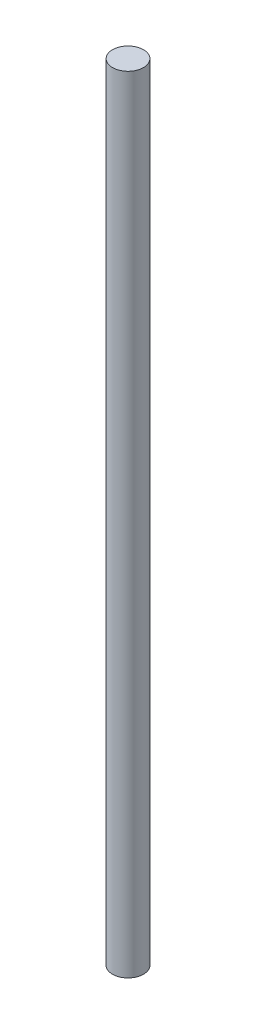
ISO-10303-21;
HEADER;
FILE_DESCRIPTION(('STEP AP214'),'2;1');
FILE_NAME('part.step','',(''),(''),'','','');
FILE_SCHEMA(('AUTOMOTIVE_DESIGN { 1 0 10303 214 1 1 1 1 }'));
ENDSEC;
DATA;
#1=APPLICATION_CONTEXT('core data for automotive mechanical design processes');
#2=APPLICATION_PROTOCOL_DEFINITION('international standard','automotive_design',2000,#1);
#3=PRODUCT_CONTEXT('',#1,'mechanical');
#4=PRODUCT('Part','Part','',(#3));
#5=PRODUCT_RELATED_PRODUCT_CATEGORY('part','',(#4));
#6=PRODUCT_DEFINITION_FORMATION('','',#4);
#7=PRODUCT_DEFINITION_CONTEXT('part definition',#1,'design');
#8=PRODUCT_DEFINITION('design','',#6,#7);
#9=PRODUCT_DEFINITION_SHAPE('','',#8);
#10=(LENGTH_UNIT() NAMED_UNIT(*) SI_UNIT(.MILLI.,.METRE.));
#11=(NAMED_UNIT(*) PLANE_ANGLE_UNIT() SI_UNIT($,.RADIAN.));
#12=(NAMED_UNIT(*) SI_UNIT($,.STERADIAN.) SOLID_ANGLE_UNIT());
#13=UNCERTAINTY_MEASURE_WITH_UNIT(LENGTH_MEASURE(1.E-05),#10,'distance_accuracy_value','');
#14=(GEOMETRIC_REPRESENTATION_CONTEXT(3) GLOBAL_UNCERTAINTY_ASSIGNED_CONTEXT((#13)) GLOBAL_UNIT_ASSIGNED_CONTEXT((#10,
#11,#12)) REPRESENTATION_CONTEXT('',''));
#15=CARTESIAN_POINT('',(0.,0.,0.));
#16=DIRECTION('',(0.,0.,1.));
#17=DIRECTION('',(1.,0.,0.));
#18=AXIS2_PLACEMENT_3D('',#15,#16,#17);
#19=CARTESIAN_POINT('',(0.,241.3,0.));
#20=DIRECTION('',(0.,-1.,0.));
#21=DIRECTION('',(0.,0.,-1.));
#22=AXIS2_PLACEMENT_3D('',#19,#20,#21);
#23=CYLINDRICAL_SURFACE('',#22,4.7625);
#24=CARTESIAN_POINT('',(0.,241.3,0.));
#25=DIRECTION('',(0.,1.,0.));
#26=DIRECTION('',(0.,0.,1.));
#27=AXIS2_PLACEMENT_3D('',#24,#25,#26);
#28=CIRCLE('',#27,4.7625);
#29=CARTESIAN_POINT('',(0.,241.3,-4.7625));
#30=VERTEX_POINT('',#29);
#31=EDGE_CURVE('E10',#30,#30,#28,.T.);
#32=CARTESIAN_POINT('',(0.,0.,0.));
#33=DIRECTION('',(0.,1.,0.));
#34=DIRECTION('',(0.,0.,1.));
#35=AXIS2_PLACEMENT_3D('',#32,#33,#34);
#36=CIRCLE('',#35,4.7625);
#37=CARTESIAN_POINT('',(0.,0.,-4.7625));
#38=VERTEX_POINT('',#37);
#39=EDGE_CURVE('E39',#38,#38,#36,.T.);
#40=CARTESIAN_POINT('',(0.,241.3,-4.7625));
#41=CARTESIAN_POINT('',(0.,238.786458333333,-4.7625));
#42=CARTESIAN_POINT('',(0.,236.272916666667,-4.7625));
#43=CARTESIAN_POINT('',(0.,231.245833333333,-4.7625));
#44=CARTESIAN_POINT('',(0.,228.732291666667,-4.7625));
#45=CARTESIAN_POINT('',(0.,223.705208333333,-4.7625));
#46=CARTESIAN_POINT('',(0.,221.191666666667,-4.7625));
#47=CARTESIAN_POINT('',(0.,216.164583333333,-4.7625));
#48=CARTESIAN_POINT('',(0.,213.651041666667,-4.7625));
#49=CARTESIAN_POINT('',(0.,208.623958333333,-4.7625));
#50=CARTESIAN_POINT('',(0.,206.110416666667,-4.7625));
#51=CARTESIAN_POINT('',(0.,201.083333333333,-4.7625));
#52=CARTESIAN_POINT('',(0.,198.569791666667,-4.7625));
#53=CARTESIAN_POINT('',(0.,193.542708333333,-4.7625));
#54=CARTESIAN_POINT('',(0.,191.029166666667,-4.7625));
#55=CARTESIAN_POINT('',(0.,186.002083333333,-4.7625));
#56=CARTESIAN_POINT('',(0.,183.488541666667,-4.7625));
#57=CARTESIAN_POINT('',(0.,178.461458333333,-4.7625));
#58=CARTESIAN_POINT('',(0.,175.947916666667,-4.7625));
#59=CARTESIAN_POINT('',(0.,170.920833333333,-4.7625));
#60=CARTESIAN_POINT('',(0.,168.407291666667,-4.7625));
#61=CARTESIAN_POINT('',(0.,163.380208333333,-4.7625));
#62=CARTESIAN_POINT('',(0.,160.866666666667,-4.7625));
#63=CARTESIAN_POINT('',(0.,155.839583333333,-4.7625));
#64=CARTESIAN_POINT('',(0.,153.326041666667,-4.7625));
#65=CARTESIAN_POINT('',(0.,148.298958333333,-4.7625));
#66=CARTESIAN_POINT('',(0.,145.785416666667,-4.7625));
#67=CARTESIAN_POINT('',(0.,140.758333333333,-4.7625));
#68=CARTESIAN_POINT('',(0.,138.244791666667,-4.7625));
#69=CARTESIAN_POINT('',(0.,133.217708333333,-4.7625));
#70=CARTESIAN_POINT('',(0.,130.704166666667,-4.7625));
#71=CARTESIAN_POINT('',(0.,125.677083333333,-4.7625));
#72=CARTESIAN_POINT('',(0.,123.163541666667,-4.7625));
#73=CARTESIAN_POINT('',(0.,118.136458333333,-4.7625));
#74=CARTESIAN_POINT('',(0.,115.622916666667,-4.7625));
#75=CARTESIAN_POINT('',(0.,110.595833333333,-4.7625));
#76=CARTESIAN_POINT('',(0.,108.082291666667,-4.7625));
#77=CARTESIAN_POINT('',(0.,103.055208333333,-4.7625));
#78=CARTESIAN_POINT('',(0.,100.541666666667,-4.7625));
#79=CARTESIAN_POINT('',(0.,95.5145833333333,-4.7625));
#80=CARTESIAN_POINT('',(0.,93.0010416666667,-4.7625));
#81=CARTESIAN_POINT('',(0.,87.9739583333333,-4.7625));
#82=CARTESIAN_POINT('',(0.,85.4604166666667,-4.7625));
#83=CARTESIAN_POINT('',(0.,80.4333333333333,-4.7625));
#84=CARTESIAN_POINT('',(0.,77.9197916666667,-4.7625));
#85=CARTESIAN_POINT('',(0.,72.8927083333333,-4.7625));
#86=CARTESIAN_POINT('',(0.,70.3791666666667,-4.7625));
#87=CARTESIAN_POINT('',(0.,65.3520833333333,-4.7625));
#88=CARTESIAN_POINT('',(0.,62.8385416666667,-4.7625));
#89=CARTESIAN_POINT('',(0.,57.8114583333333,-4.7625));
#90=CARTESIAN_POINT('',(0.,55.2979166666667,-4.7625));
#91=CARTESIAN_POINT('',(0.,50.2708333333333,-4.7625));
#92=CARTESIAN_POINT('',(0.,47.7572916666667,-4.7625));
#93=CARTESIAN_POINT('',(0.,42.7302083333333,-4.7625));
#94=CARTESIAN_POINT('',(0.,40.2166666666667,-4.7625));
#95=CARTESIAN_POINT('',(0.,35.1895833333333,-4.7625));
#96=CARTESIAN_POINT('',(0.,32.6760416666667,-4.7625));
#97=CARTESIAN_POINT('',(0.,27.6489583333333,-4.7625));
#98=CARTESIAN_POINT('',(0.,25.1354166666667,-4.7625));
#99=CARTESIAN_POINT('',(0.,20.1083333333333,-4.7625));
#100=CARTESIAN_POINT('',(0.,17.5947916666667,-4.7625));
#101=CARTESIAN_POINT('',(0.,12.5677083333333,-4.7625));
#102=CARTESIAN_POINT('',(0.,10.0541666666667,-4.7625));
#103=CARTESIAN_POINT('',(0.,5.02708333333333,-4.7625));
#104=CARTESIAN_POINT('',(0.,2.51354166666667,-4.7625));
#105=CARTESIAN_POINT('',(0.,0.,-4.7625));
#106=B_SPLINE_CURVE_WITH_KNOTS('',3,(#40,#41,#42,#43,#44,#45,#46,#47,#48,#49,#50,#51,#52,#53,
#54,#55,#56,#57,#58,#59,#60,#61,#62,#63,#64,#65,#66,#67,#68,#69,#70,#71,#72,#73,#74,#75,#76,#77,
#78,#79,#80,#81,#82,#83,#84,#85,#86,#87,#88,#89,#90,#91,#92,#93,#94,#95,#96,#97,#98,#99,#100,
#101,#102,#103,#104,#105),.UNSPECIFIED.,.F.,.F.,(4,2,2,2,2,2,2,2,2,2,2,2,2,2,2,2,2,2,2,2,2,2,2,
2,2,2,2,2,2,2,2,2,4),(0.,7.540625,15.08125,22.621875,30.1625,37.703125,45.24375,52.784375,
60.325,67.865625,75.40625,82.946875,90.4875,98.028125,105.56875,113.109375,120.65,128.190625,
135.73125,143.271875,150.8125,158.353125,165.89375,173.434375,180.975,188.515625,196.05625,
203.596875,211.1375,218.678125,226.21875,233.759375,241.3),.UNSPECIFIED.);
#107=EDGE_CURVE('BSEAM36',#30,#38,#106,.T.);
#108=ORIENTED_EDGE('',*,*,#31,.F.);
#109=ORIENTED_EDGE('',*,*,#39,.T.);
#110=ORIENTED_EDGE('',*,*,#107,.T.);
#111=ORIENTED_EDGE('',*,*,#107,.F.);
#112=EDGE_LOOP('',(#108,#110,#109,#111));
#113=FACE_BOUND('',#112,.T.);
#114=ADVANCED_FACE('F36',(#113),#23,.T.);
#115=CARTESIAN_POINT('',(0.,241.3,0.));
#116=DIRECTION('',(0.,1.,0.));
#117=DIRECTION('',(0.,0.,1.));
#118=AXIS2_PLACEMENT_3D('',#115,#116,#117);
#119=PLANE('',#118);
#120=ORIENTED_EDGE('',*,*,#31,.T.);
#121=EDGE_LOOP('',(#120));
#122=FACE_BOUND('',#121,.T.);
#123=ADVANCED_FACE('F51',(#122),#119,.T.);
#124=CARTESIAN_POINT('',(0.,0.,0.));
#125=DIRECTION('',(0.,1.,0.));
#126=DIRECTION('',(0.,0.,1.));
#127=AXIS2_PLACEMENT_3D('',#124,#125,#126);
#128=PLANE('',#127);
#129=ORIENTED_EDGE('',*,*,#39,.F.);
#130=EDGE_LOOP('',(#129));
#131=FACE_BOUND('',#130,.T.);
#132=ADVANCED_FACE('F49',(#131),#128,.F.);
#133=CLOSED_SHELL('',(#114,#123,#132));
#134=MANIFOLD_SOLID_BREP('B2',#133);
#135=ADVANCED_BREP_SHAPE_REPRESENTATION('',(#18,#134),#14);
#136=SHAPE_DEFINITION_REPRESENTATION(#9,#135);
ENDSEC;
END-ISO-10303-21;
